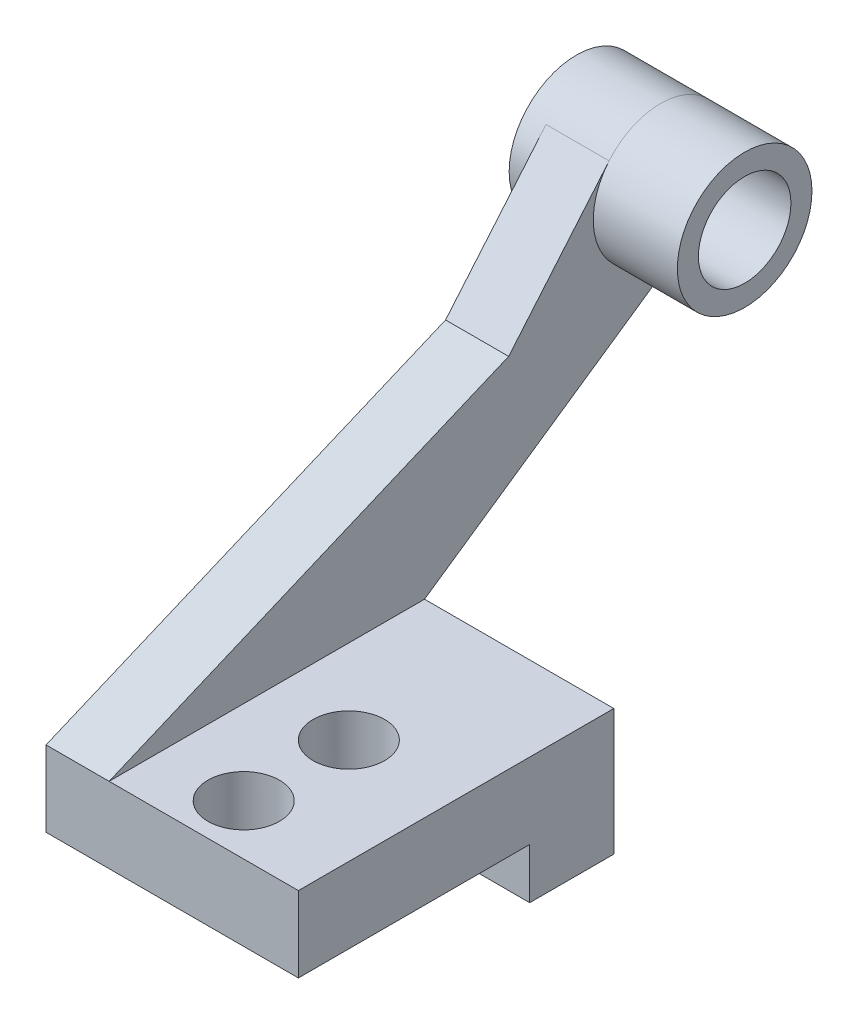
ISO-10303-21;
HEADER;
FILE_DESCRIPTION(('STEP AP214'),'2;1');
FILE_NAME('part.step','',(''),(''),'','','');
FILE_SCHEMA(('AUTOMOTIVE_DESIGN { 1 0 10303 214 1 1 1 1 }'));
ENDSEC;
DATA;
#1=APPLICATION_CONTEXT('core data for automotive mechanical design processes');
#2=APPLICATION_PROTOCOL_DEFINITION('international standard','automotive_design',2000,#1);
#3=PRODUCT_CONTEXT('',#1,'mechanical');
#4=PRODUCT('Part','Part','',(#3));
#5=PRODUCT_RELATED_PRODUCT_CATEGORY('part','',(#4));
#6=PRODUCT_DEFINITION_FORMATION('','',#4);
#7=PRODUCT_DEFINITION_CONTEXT('part definition',#1,'design');
#8=PRODUCT_DEFINITION('design','',#6,#7);
#9=PRODUCT_DEFINITION_SHAPE('','',#8);
#10=(LENGTH_UNIT() NAMED_UNIT(*) SI_UNIT(.MILLI.,.METRE.));
#11=(NAMED_UNIT(*) PLANE_ANGLE_UNIT() SI_UNIT($,.RADIAN.));
#12=(NAMED_UNIT(*) SI_UNIT($,.STERADIAN.) SOLID_ANGLE_UNIT());
#13=UNCERTAINTY_MEASURE_WITH_UNIT(LENGTH_MEASURE(1.E-05),#10,'distance_accuracy_value','');
#14=(GEOMETRIC_REPRESENTATION_CONTEXT(3) GLOBAL_UNCERTAINTY_ASSIGNED_CONTEXT((#13)) GLOBAL_UNIT_ASSIGNED_CONTEXT((#10,
#11,#12)) REPRESENTATION_CONTEXT('',''));
#15=CARTESIAN_POINT('',(0.,0.,0.));
#16=DIRECTION('',(0.,0.,1.));
#17=DIRECTION('',(1.,0.,0.));
#18=AXIS2_PLACEMENT_3D('',#15,#16,#17);
#19=CARTESIAN_POINT('',(-60.,0.,-25.6553758959827));
#20=DIRECTION('',(0.,-1.,0.));
#21=DIRECTION('',(0.,0.,-1.));
#22=AXIS2_PLACEMENT_3D('',#19,#20,#21);
#23=PLANE('',#22);
#24=CARTESIAN_POINT('',(-25.,0.,17.3446241040173));
#25=DIRECTION('',(0.,-1.,0.));
#26=DIRECTION('',(0.,0.,-1.));
#27=AXIS2_PLACEMENT_3D('',#24,#25,#26);
#28=CIRCLE('',#27,8.5);
#29=CARTESIAN_POINT('',(-25.,0.,8.84462410401734));
#30=VERTEX_POINT('',#29);
#31=EDGE_CURVE('E252',#30,#30,#28,.T.);
#32=ORIENTED_EDGE('',*,*,#31,.F.);
#33=EDGE_LOOP('',(#32));
#34=FACE_BOUND('',#33,.T.);
#35=CARTESIAN_POINT('',(-25.,0.,-7.65537589598266));
#36=DIRECTION('',(0.,-1.,0.));
#37=DIRECTION('',(0.,0.,-1.));
#38=AXIS2_PLACEMENT_3D('',#35,#36,#37);
#39=CIRCLE('',#38,8.5);
#40=CARTESIAN_POINT('',(-25.,0.,-16.1553758959827));
#41=VERTEX_POINT('',#40);
#42=EDGE_CURVE('E255',#41,#41,#39,.T.);
#43=ORIENTED_EDGE('',*,*,#42,.F.);
#44=EDGE_LOOP('',(#43));
#45=FACE_BOUND('',#44,.T.);
#46=DIRECTION('',(0.,0.,-1.));
#47=VECTOR('',#46,1.);
#48=CARTESIAN_POINT('',(0.,0.,-25.6553758959827));
#49=LINE('',#48,#47);
#50=CARTESIAN_POINT('',(0.,0.,29.3446241040173));
#51=VERTEX_POINT('',#50);
#52=CARTESIAN_POINT('',(0.,0.,-25.6553758959827));
#53=VERTEX_POINT('',#52);
#54=EDGE_CURVE('E177',#51,#53,#49,.T.);
#55=ORIENTED_EDGE('',*,*,#54,.F.);
#56=DIRECTION('',(1.,0.,0.));
#57=VECTOR('',#56,1.);
#58=CARTESIAN_POINT('',(-60.,0.,29.3446241040173));
#59=LINE('',#58,#57);
#60=CARTESIAN_POINT('',(-60.,0.,29.3446241040173));
#61=VERTEX_POINT('',#60);
#62=EDGE_CURVE('E67',#61,#51,#59,.T.);
#63=ORIENTED_EDGE('',*,*,#62,.F.);
#64=DIRECTION('',(0.,0.,-1.));
#65=VECTOR('',#64,1.);
#66=CARTESIAN_POINT('',(-60.,0.,-25.6553758959827));
#67=LINE('',#66,#65);
#68=CARTESIAN_POINT('',(-60.,0.,-25.6553758959827));
#69=VERTEX_POINT('',#68);
#70=EDGE_CURVE('E183',#61,#69,#67,.T.);
#71=ORIENTED_EDGE('',*,*,#70,.T.);
#72=DIRECTION('',(1.,0.,0.));
#73=VECTOR('',#72,1.);
#74=CARTESIAN_POINT('',(-60.,0.,-25.6553758959827));
#75=LINE('',#74,#73);
#76=EDGE_CURVE('E62',#69,#53,#75,.T.);
#77=ORIENTED_EDGE('',*,*,#76,.T.);
#78=EDGE_LOOP('',(#55,#63,#71,#77));
#79=FACE_BOUND('',#78,.T.);
#80=ADVANCED_FACE('F59',(#34,#45,#79),#23,.T.);
#81=CARTESIAN_POINT('',(-60.,0.,29.3446241040173));
#82=DIRECTION('',(0.,0.,1.));
#83=DIRECTION('',(0.,-1.,0.));
#84=AXIS2_PLACEMENT_3D('',#81,#82,#83);
#85=PLANE('',#84);
#86=DIRECTION('',(0.,-1.,0.));
#87=VECTOR('',#86,1.);
#88=CARTESIAN_POINT('',(0.,0.,29.3446241040173));
#89=LINE('',#88,#87);
#90=CARTESIAN_POINT('',(0.,18.,29.3446241040173));
#91=VERTEX_POINT('',#90);
#92=EDGE_CURVE('E186',#91,#51,#89,.T.);
#93=ORIENTED_EDGE('',*,*,#92,.F.);
#94=DIRECTION('',(1.,0.,0.));
#95=VECTOR('',#94,1.);
#96=CARTESIAN_POINT('',(-60.,18.,29.3446241040173));
#97=LINE('',#96,#95);
#98=CARTESIAN_POINT('',(-45.,18.,29.3446241040173));
#99=VERTEX_POINT('',#98);
#100=EDGE_CURVE('E152',#99,#91,#97,.T.);
#101=ORIENTED_EDGE('',*,*,#100,.F.);
#102=CARTESIAN_POINT('',(-60.,18.,29.3446241040173));
#103=VERTEX_POINT('',#102);
#104=EDGE_CURVE('E207',#103,#99,#97,.T.);
#105=ORIENTED_EDGE('',*,*,#104,.F.);
#106=DIRECTION('',(0.,-1.,0.));
#107=VECTOR('',#106,1.);
#108=CARTESIAN_POINT('',(-60.,0.,29.3446241040173));
#109=LINE('',#108,#107);
#110=EDGE_CURVE('E139',#103,#61,#109,.T.);
#111=ORIENTED_EDGE('',*,*,#110,.T.);
#112=ORIENTED_EDGE('',*,*,#62,.T.);
#113=EDGE_LOOP('',(#93,#101,#105,#111,#112));
#114=FACE_BOUND('',#113,.T.);
#115=ADVANCED_FACE('F216',(#114),#85,.T.);
#116=CARTESIAN_POINT('',(-60.,18.,29.3446241040173));
#117=DIRECTION('',(0.,1.,0.));
#118=DIRECTION('',(0.,0.,1.));
#119=AXIS2_PLACEMENT_3D('',#116,#117,#118);
#120=PLANE('',#119);
#121=CARTESIAN_POINT('',(-25.,18.,17.3446241040173));
#122=DIRECTION('',(0.,1.,0.));
#123=DIRECTION('',(0.,0.,1.));
#124=AXIS2_PLACEMENT_3D('',#121,#122,#123);
#125=CIRCLE('',#124,8.5);
#126=CARTESIAN_POINT('',(-25.,18.,25.8446241040173));
#127=VERTEX_POINT('',#126);
#128=EDGE_CURVE('E258',#127,#127,#125,.T.);
#129=ORIENTED_EDGE('',*,*,#128,.F.);
#130=EDGE_LOOP('',(#129));
#131=FACE_BOUND('',#130,.T.);
#132=CARTESIAN_POINT('',(-25.,18.,-7.65537589598266));
#133=DIRECTION('',(0.,1.,0.));
#134=DIRECTION('',(0.,0.,1.));
#135=AXIS2_PLACEMENT_3D('',#132,#133,#134);
#136=CIRCLE('',#135,8.5);
#137=CARTESIAN_POINT('',(-25.,18.,0.844624104017344));
#138=VERTEX_POINT('',#137);
#139=EDGE_CURVE('E259',#138,#138,#136,.T.);
#140=ORIENTED_EDGE('',*,*,#139,.F.);
#141=EDGE_LOOP('',(#140));
#142=FACE_BOUND('',#141,.T.);
#143=DIRECTION('',(0.,0.,-1.));
#144=VECTOR('',#143,1.);
#145=CARTESIAN_POINT('',(-45.,18.,0.));
#146=LINE('',#145,#144);
#147=CARTESIAN_POINT('',(-45.,18.,-45.6553758959827));
#148=VERTEX_POINT('',#147);
#149=EDGE_CURVE('E75',#99,#148,#146,.T.);
#150=ORIENTED_EDGE('',*,*,#149,.F.);
#151=ORIENTED_EDGE('',*,*,#100,.T.);
#152=DIRECTION('',(0.,0.,1.));
#153=VECTOR('',#152,1.);
#154=CARTESIAN_POINT('',(0.,18.,29.3446241040173));
#155=LINE('',#154,#153);
#156=CARTESIAN_POINT('',(0.,18.,-45.6553758959827));
#157=VERTEX_POINT('',#156);
#158=EDGE_CURVE('E201',#157,#91,#155,.T.);
#159=ORIENTED_EDGE('',*,*,#158,.F.);
#160=DIRECTION('',(1.,0.,0.));
#161=VECTOR('',#160,1.);
#162=CARTESIAN_POINT('',(-60.,18.,-45.6553758959827));
#163=LINE('',#162,#161);
#164=EDGE_CURVE('E153',#148,#157,#163,.T.);
#165=ORIENTED_EDGE('',*,*,#164,.F.);
#166=EDGE_LOOP('',(#150,#151,#159,#165));
#167=FACE_BOUND('',#166,.T.);
#168=ADVANCED_FACE('F267',(#131,#142,#167),#120,.T.);
#169=CARTESIAN_POINT('',(-60.,18.,-45.6553758959827));
#170=DIRECTION('',(0.,0.,-1.));
#171=DIRECTION('',(0.,1.,0.));
#172=AXIS2_PLACEMENT_3D('',#169,#170,#171);
#173=PLANE('',#172);
#174=DIRECTION('',(0.,1.,0.));
#175=VECTOR('',#174,1.);
#176=CARTESIAN_POINT('',(0.,18.,-45.6553758959827));
#177=LINE('',#176,#175);
#178=CARTESIAN_POINT('',(0.,-12.,-45.6553758959827));
#179=VERTEX_POINT('',#178);
#180=EDGE_CURVE('E198',#179,#157,#177,.T.);
#181=ORIENTED_EDGE('',*,*,#180,.F.);
#182=DIRECTION('',(1.,0.,0.));
#183=VECTOR('',#182,1.);
#184=CARTESIAN_POINT('',(-60.,-12.,-45.6553758959827));
#185=LINE('',#184,#183);
#186=CARTESIAN_POINT('',(-60.,-12.,-45.6553758959827));
#187=VERTEX_POINT('',#186);
#188=EDGE_CURVE('E134',#187,#179,#185,.T.);
#189=ORIENTED_EDGE('',*,*,#188,.F.);
#190=DIRECTION('',(0.,1.,0.));
#191=VECTOR('',#190,1.);
#192=CARTESIAN_POINT('',(-60.,18.,-45.6553758959827));
#193=LINE('',#192,#191);
#194=CARTESIAN_POINT('',(-60.,18.,-45.6553758959827));
#195=VERTEX_POINT('',#194);
#196=EDGE_CURVE('E128',#187,#195,#193,.T.);
#197=ORIENTED_EDGE('',*,*,#196,.T.);
#198=EDGE_CURVE('E133',#195,#148,#163,.T.);
#199=ORIENTED_EDGE('',*,*,#198,.T.);
#200=ORIENTED_EDGE('',*,*,#164,.T.);
#201=EDGE_LOOP('',(#181,#189,#197,#199,#200));
#202=FACE_BOUND('',#201,.T.);
#203=ADVANCED_FACE('F131',(#202),#173,.T.);
#204=CARTESIAN_POINT('',(-60.,-12.,-45.6553758959827));
#205=DIRECTION('',(0.,-1.,0.));
#206=DIRECTION('',(0.,0.,-1.));
#207=AXIS2_PLACEMENT_3D('',#204,#205,#206);
#208=PLANE('',#207);
#209=DIRECTION('',(0.,0.,-1.));
#210=VECTOR('',#209,1.);
#211=CARTESIAN_POINT('',(0.,-12.,-45.6553758959827));
#212=LINE('',#211,#210);
#213=CARTESIAN_POINT('',(0.,-12.,-25.6553758959827));
#214=VERTEX_POINT('',#213);
#215=EDGE_CURVE('E195',#214,#179,#212,.T.);
#216=ORIENTED_EDGE('',*,*,#215,.F.);
#217=DIRECTION('',(1.,0.,0.));
#218=VECTOR('',#217,1.);
#219=CARTESIAN_POINT('',(-60.,-12.,-25.6553758959827));
#220=LINE('',#219,#218);
#221=CARTESIAN_POINT('',(-60.,-12.,-25.6553758959827));
#222=VERTEX_POINT('',#221);
#223=EDGE_CURVE('E210',#222,#214,#220,.T.);
#224=ORIENTED_EDGE('',*,*,#223,.F.);
#225=DIRECTION('',(0.,0.,-1.));
#226=VECTOR('',#225,1.);
#227=CARTESIAN_POINT('',(-60.,-12.,-45.6553758959827));
#228=LINE('',#227,#226);
#229=EDGE_CURVE('E140',#222,#187,#228,.T.);
#230=ORIENTED_EDGE('',*,*,#229,.T.);
#231=ORIENTED_EDGE('',*,*,#188,.T.);
#232=EDGE_LOOP('',(#216,#224,#230,#231));
#233=FACE_BOUND('',#232,.T.);
#234=ADVANCED_FACE('F303',(#233),#208,.T.);
#235=CARTESIAN_POINT('',(-60.,-12.,-25.6553758959827));
#236=DIRECTION('',(0.,0.,1.));
#237=DIRECTION('',(1.,0.,0.));
#238=AXIS2_PLACEMENT_3D('',#235,#236,#237);
#239=PLANE('',#238);
#240=DIRECTION('',(0.,-1.,0.));
#241=VECTOR('',#240,1.);
#242=CARTESIAN_POINT('',(0.,-12.,-25.6553758959827));
#243=LINE('',#242,#241);
#244=EDGE_CURVE('E192',#53,#214,#243,.T.);
#245=ORIENTED_EDGE('',*,*,#244,.F.);
#246=ORIENTED_EDGE('',*,*,#76,.F.);
#247=DIRECTION('',(0.,-1.,0.));
#248=VECTOR('',#247,1.);
#249=CARTESIAN_POINT('',(-60.,-12.,-25.6553758959827));
#250=LINE('',#249,#248);
#251=EDGE_CURVE('E185',#69,#222,#250,.T.);
#252=ORIENTED_EDGE('',*,*,#251,.T.);
#253=ORIENTED_EDGE('',*,*,#223,.T.);
#254=EDGE_LOOP('',(#245,#246,#252,#253));
#255=FACE_BOUND('',#254,.T.);
#256=ADVANCED_FACE('F212',(#255),#239,.T.);
#257=CARTESIAN_POINT('',(-60.,0.,0.));
#258=DIRECTION('',(-1.,0.,0.));
#259=DIRECTION('',(0.,0.,1.));
#260=AXIS2_PLACEMENT_3D('',#257,#258,#259);
#261=PLANE('',#260);
#262=CARTESIAN_POINT('',(-60.,76.,-101.767701538135));
#263=DIRECTION('',(-1.,0.,0.));
#264=DIRECTION('',(0.,0.,1.));
#265=AXIS2_PLACEMENT_3D('',#262,#263,#264);
#266=CIRCLE('',#265,16.);
#267=CARTESIAN_POINT('',(-60.,62.8159230644065,-110.833026427865));
#268=VERTEX_POINT('',#267);
#269=CARTESIAN_POINT('',(-60.,86.3155137596286,-89.5369952676489));
#270=VERTEX_POINT('',#269);
#271=EDGE_CURVE('E12',#268,#270,#266,.T.);
#272=ORIENTED_EDGE('',*,*,#271,.F.);
#273=DIRECTION('',(0.,0.566582805608105,-0.824004808474592));
#274=VECTOR('',#273,1.);
#275=CARTESIAN_POINT('',(-60.,-9.09327574063561,-6.25250438870018));
#276=LINE('',#275,#274);
#277=EDGE_CURVE('E148',#195,#268,#276,.T.);
#278=ORIENTED_EDGE('',*,*,#277,.F.);
#279=ORIENTED_EDGE('',*,*,#196,.F.);
#280=ORIENTED_EDGE('',*,*,#229,.F.);
#281=ORIENTED_EDGE('',*,*,#251,.F.);
#282=ORIENTED_EDGE('',*,*,#70,.F.);
#283=ORIENTED_EDGE('',*,*,#110,.F.);
#284=DIRECTION('',(0.,0.388057000058133,-0.921635375138065));
#285=VECTOR('',#284,1.);
#286=CARTESIAN_POINT('',(-60.,25.7844302677897,10.8566022180167));
#287=LINE('',#286,#285);
#288=CARTESIAN_POINT('',(-60.,58.,-65.6553758959827));
#289=VERTEX_POINT('',#288);
#290=EDGE_CURVE('E159',#103,#289,#287,.T.);
#291=ORIENTED_EDGE('',*,*,#290,.T.);
#292=DIRECTION('',(0.,-0.764419141905391,0.644719609976791));
#293=VECTOR('',#292,1.);
#294=CARTESIAN_POINT('',(-60.,-8.24885778078215,-9.78035209245783));
#295=LINE('',#294,#293);
#296=EDGE_CURVE('E163',#270,#289,#295,.T.);
#297=ORIENTED_EDGE('',*,*,#296,.F.);
#298=EDGE_LOOP('',(#272,#278,#279,#280,#281,#282,#283,#291,#297));
#299=FACE_BOUND('',#298,.T.);
#300=ADVANCED_FACE('F156',(#299),#261,.T.);
#301=CARTESIAN_POINT('',(0.,0.,0.));
#302=DIRECTION('',(-1.,0.,0.));
#303=DIRECTION('',(0.,0.,1.));
#304=AXIS2_PLACEMENT_3D('',#301,#302,#303);
#305=PLANE('',#304);
#306=ORIENTED_EDGE('',*,*,#54,.T.);
#307=ORIENTED_EDGE('',*,*,#244,.T.);
#308=ORIENTED_EDGE('',*,*,#215,.T.);
#309=ORIENTED_EDGE('',*,*,#180,.T.);
#310=ORIENTED_EDGE('',*,*,#158,.T.);
#311=ORIENTED_EDGE('',*,*,#92,.T.);
#312=EDGE_LOOP('',(#306,#307,#308,#309,#310,#311));
#313=FACE_BOUND('',#312,.T.);
#314=ADVANCED_FACE('F214',(#313),#305,.F.);
#315=CARTESIAN_POINT('',(-45.,-8.24885778078215,-9.78035209245783));
#316=DIRECTION('',(0.,-0.644719609976791,-0.764419141905391));
#317=DIRECTION('',(0.,0.764419141905391,-0.644719609976791));
#318=AXIS2_PLACEMENT_3D('',#315,#316,#317);
#319=PLANE('',#318);
#320=ORIENTED_EDGE('',*,*,#296,.T.);
#321=DIRECTION('',(-1.,0.,0.));
#322=VECTOR('',#321,1.);
#323=CARTESIAN_POINT('',(-45.,58.,-65.6553758959827));
#324=LINE('',#323,#322);
#325=CARTESIAN_POINT('',(-45.,58.,-65.6553758959827));
#326=VERTEX_POINT('',#325);
#327=EDGE_CURVE('E178',#326,#289,#324,.T.);
#328=ORIENTED_EDGE('',*,*,#327,.F.);
#329=DIRECTION('',(0.,-0.764419141905391,0.644719609976791));
#330=VECTOR('',#329,1.);
#331=CARTESIAN_POINT('',(-45.,-8.24885778078215,-9.78035209245783));
#332=LINE('',#331,#330);
#333=CARTESIAN_POINT('',(-45.,86.1057396841625,-89.360069478244));
#334=VERTEX_POINT('',#333);
#335=EDGE_CURVE('E229',#334,#326,#332,.T.);
#336=ORIENTED_EDGE('',*,*,#335,.F.);
#337=CARTESIAN_POINT('',(-45.,86.3155137596286,-89.5369952676489));
#338=VERTEX_POINT('',#337);
#339=EDGE_CURVE('E169',#338,#334,#332,.T.);
#340=ORIENTED_EDGE('',*,*,#339,.F.);
#341=DIRECTION('',(-1.,0.,0.));
#342=VECTOR('',#341,1.);
#343=CARTESIAN_POINT('',(-45.,86.3155137596286,-89.5369952676489));
#344=LINE('',#343,#342);
#345=EDGE_CURVE('E174',#338,#270,#344,.T.);
#346=ORIENTED_EDGE('',*,*,#345,.T.);
#347=EDGE_LOOP('',(#320,#328,#336,#340,#346));
#348=FACE_BOUND('',#347,.T.);
#349=ADVANCED_FACE('F313',(#348),#319,.F.);
#350=CARTESIAN_POINT('',(-45.,25.7844302677897,10.8566022180167));
#351=DIRECTION('',(0.,0.921635375138065,0.388057000058133));
#352=DIRECTION('',(0.,-0.388057000058133,0.921635375138065));
#353=AXIS2_PLACEMENT_3D('',#350,#351,#352);
#354=PLANE('',#353);
#355=ORIENTED_EDGE('',*,*,#290,.F.);
#356=ORIENTED_EDGE('',*,*,#104,.T.);
#357=DIRECTION('',(0.,0.388057000058133,-0.921635375138065));
#358=VECTOR('',#357,1.);
#359=CARTESIAN_POINT('',(-45.,25.7844302677897,10.8566022180167));
#360=LINE('',#359,#358);
#361=EDGE_CURVE('E223',#99,#326,#360,.T.);
#362=ORIENTED_EDGE('',*,*,#361,.T.);
#363=ORIENTED_EDGE('',*,*,#327,.T.);
#364=EDGE_LOOP('',(#355,#356,#362,#363));
#365=FACE_BOUND('',#364,.T.);
#366=ADVANCED_FACE('F222',(#365),#354,.T.);
#367=CARTESIAN_POINT('',(-45.,-9.09327574063561,-6.25250438870018));
#368=DIRECTION('',(0.,0.824004808474592,0.566582805608105));
#369=DIRECTION('',(0.,-0.566582805608105,0.824004808474592));
#370=AXIS2_PLACEMENT_3D('',#367,#368,#369);
#371=PLANE('',#370);
#372=ORIENTED_EDGE('',*,*,#277,.T.);
#373=DIRECTION('',(-1.,0.,0.));
#374=VECTOR('',#373,1.);
#375=CARTESIAN_POINT('',(-45.,62.8159230644065,-110.833026427865));
#376=LINE('',#375,#374);
#377=CARTESIAN_POINT('',(-45.,62.8159230644065,-110.833026427865));
#378=VERTEX_POINT('',#377);
#379=EDGE_CURVE('E181',#378,#268,#376,.T.);
#380=ORIENTED_EDGE('',*,*,#379,.F.);
#381=DIRECTION('',(0.,0.566582805608105,-0.824004808474592));
#382=VECTOR('',#381,1.);
#383=CARTESIAN_POINT('',(-45.,-9.09327574063561,-6.25250438870018));
#384=LINE('',#383,#382);
#385=CARTESIAN_POINT('',(-45.,62.6604397991311,-110.606900684273));
#386=VERTEX_POINT('',#385);
#387=EDGE_CURVE('E166',#386,#378,#384,.T.);
#388=ORIENTED_EDGE('',*,*,#387,.F.);
#389=DIRECTION('',(0.,0.566582805608105,-0.824004808474592));
#390=VECTOR('',#389,1.);
#391=CARTESIAN_POINT('',(-45.,-9.09327574063561,-6.25250438870018));
#392=LINE('',#391,#390);
#393=EDGE_CURVE('E151',#148,#386,#392,.T.);
#394=ORIENTED_EDGE('',*,*,#393,.F.);
#395=ORIENTED_EDGE('',*,*,#198,.F.);
#396=EDGE_LOOP('',(#372,#380,#388,#394,#395));
#397=FACE_BOUND('',#396,.T.);
#398=ADVANCED_FACE('F145',(#397),#371,.F.);
#399=CARTESIAN_POINT('',(-45.,0.,0.));
#400=DIRECTION('',(-1.,0.,0.));
#401=DIRECTION('',(0.,0.,1.));
#402=AXIS2_PLACEMENT_3D('',#399,#400,#401);
#403=PLANE('',#402);
#404=CARTESIAN_POINT('',(-45.,76.,-101.767701538135));
#405=DIRECTION('',(1.,0.,0.));
#406=DIRECTION('',(0.,0.,-1.));
#407=AXIS2_PLACEMENT_3D('',#404,#405,#406);
#408=CIRCLE('',#407,16.0023531987547);
#409=EDGE_CURVE('E237',#334,#386,#408,.T.);
#410=ORIENTED_EDGE('',*,*,#409,.F.);
#411=ORIENTED_EDGE('',*,*,#335,.T.);
#412=ORIENTED_EDGE('',*,*,#361,.F.);
#413=ORIENTED_EDGE('',*,*,#149,.T.);
#414=ORIENTED_EDGE('',*,*,#393,.T.);
#415=EDGE_LOOP('',(#410,#411,#412,#413,#414));
#416=FACE_BOUND('',#415,.T.);
#417=ADVANCED_FACE('F227',(#416),#403,.F.);
#418=CARTESIAN_POINT('',(-45.,76.,-101.767701538135));
#419=DIRECTION('',(-1.,0.,0.));
#420=DIRECTION('',(0.,0.,1.));
#421=AXIS2_PLACEMENT_3D('',#418,#419,#420);
#422=CYLINDRICAL_SURFACE('',#421,16.);
#423=ORIENTED_EDGE('',*,*,#345,.F.);
#424=CARTESIAN_POINT('',(-45.,76.,-101.767701538135));
#425=DIRECTION('',(-1.,0.,0.));
#426=DIRECTION('',(0.,0.,1.));
#427=AXIS2_PLACEMENT_3D('',#424,#425,#426);
#428=CIRCLE('',#427,16.);
#429=EDGE_CURVE('E160',#338,#378,#428,.T.);
#430=ORIENTED_EDGE('',*,*,#429,.T.);
#431=ORIENTED_EDGE('',*,*,#379,.T.);
#432=ORIENTED_EDGE('',*,*,#271,.T.);
#433=EDGE_LOOP('',(#423,#430,#431,#432));
#434=FACE_BOUND('',#433,.T.);
#435=CARTESIAN_POINT('',(-65.,76.,-101.767701538135));
#436=DIRECTION('',(-1.,0.,0.));
#437=DIRECTION('',(0.,0.,1.));
#438=AXIS2_PLACEMENT_3D('',#435,#436,#437);
#439=CIRCLE('',#438,16.);
#440=CARTESIAN_POINT('',(-65.,76.,-85.7677015381351));
#441=VERTEX_POINT('',#440);
#442=EDGE_CURVE('E245',#441,#441,#439,.T.);
#443=ORIENTED_EDGE('',*,*,#442,.F.);
#444=EDGE_LOOP('',(#443));
#445=FACE_BOUND('',#444,.T.);
#446=ADVANCED_FACE('F314',(#434,#445),#422,.T.);
#447=CARTESIAN_POINT('',(-45.,76.,-101.767701538135));
#448=DIRECTION('',(1.,0.,0.));
#449=DIRECTION('',(0.,0.,-1.));
#450=AXIS2_PLACEMENT_3D('',#447,#448,#449);
#451=PLANE('',#450);
#452=ORIENTED_EDGE('',*,*,#429,.F.);
#453=ORIENTED_EDGE('',*,*,#339,.T.);
#454=EDGE_CURVE('E240',#386,#334,#408,.T.);
#455=ORIENTED_EDGE('',*,*,#454,.F.);
#456=ORIENTED_EDGE('',*,*,#387,.T.);
#457=EDGE_LOOP('',(#452,#453,#455,#456));
#458=FACE_BOUND('',#457,.T.);
#459=ADVANCED_FACE('F318',(#458),#451,.F.);
#460=CARTESIAN_POINT('',(-25.,76.,-101.767701538135));
#461=DIRECTION('',(1.,0.,0.));
#462=DIRECTION('',(0.,0.,-1.));
#463=AXIS2_PLACEMENT_3D('',#460,#461,#462);
#464=PLANE('',#463);
#465=CARTESIAN_POINT('',(-25.,76.,-101.767701538135));
#466=DIRECTION('',(1.,0.,0.));
#467=DIRECTION('',(0.,0.,-1.));
#468=AXIS2_PLACEMENT_3D('',#465,#466,#467);
#469=CIRCLE('',#468,16.0023531987547);
#470=CARTESIAN_POINT('',(-25.,76.,-117.77005473689));
#471=VERTEX_POINT('',#470);
#472=EDGE_CURVE('E236',#471,#471,#469,.T.);
#473=ORIENTED_EDGE('',*,*,#472,.T.);
#474=EDGE_LOOP('',(#473));
#475=FACE_BOUND('',#474,.T.);
#476=CARTESIAN_POINT('',(-25.,76.,-101.767701538135));
#477=DIRECTION('',(1.,0.,0.));
#478=DIRECTION('',(0.,0.,-1.));
#479=AXIS2_PLACEMENT_3D('',#476,#477,#478);
#480=CIRCLE('',#479,11.);
#481=CARTESIAN_POINT('',(-25.,76.,-112.767701538135));
#482=VERTEX_POINT('',#481);
#483=EDGE_CURVE('E243',#482,#482,#480,.T.);
#484=ORIENTED_EDGE('',*,*,#483,.F.);
#485=EDGE_LOOP('',(#484));
#486=FACE_BOUND('',#485,.T.);
#487=ADVANCED_FACE('F332',(#475,#486),#464,.T.);
#488=CARTESIAN_POINT('',(-25.,76.,-101.767701538135));
#489=DIRECTION('',(-1.,0.,0.));
#490=DIRECTION('',(0.,0.,1.));
#491=AXIS2_PLACEMENT_3D('',#488,#489,#490);
#492=CYLINDRICAL_SURFACE('',#491,16.0023531987547);
#493=ORIENTED_EDGE('',*,*,#472,.F.);
#494=EDGE_LOOP('',(#493));
#495=FACE_BOUND('',#494,.T.);
#496=ORIENTED_EDGE('',*,*,#409,.T.);
#497=ORIENTED_EDGE('',*,*,#454,.T.);
#498=EDGE_LOOP('',(#496,#497));
#499=FACE_BOUND('',#498,.T.);
#500=ADVANCED_FACE('F329',(#495,#499),#492,.T.);
#501=CARTESIAN_POINT('',(-25.,76.,-101.767701538135));
#502=DIRECTION('',(-1.,0.,0.));
#503=DIRECTION('',(0.,0.,1.));
#504=AXIS2_PLACEMENT_3D('',#501,#502,#503);
#505=CYLINDRICAL_SURFACE('',#504,11.);
#506=ORIENTED_EDGE('',*,*,#483,.T.);
#507=EDGE_LOOP('',(#506));
#508=FACE_BOUND('',#507,.T.);
#509=CARTESIAN_POINT('',(-65.,76.,-101.767701538135));
#510=DIRECTION('',(-1.,0.,0.));
#511=DIRECTION('',(0.,0.,1.));
#512=AXIS2_PLACEMENT_3D('',#509,#510,#511);
#513=CIRCLE('',#512,11.);
#514=CARTESIAN_POINT('',(-65.,76.,-90.7677015381351));
#515=VERTEX_POINT('',#514);
#516=EDGE_CURVE('E249',#515,#515,#513,.T.);
#517=ORIENTED_EDGE('',*,*,#516,.T.);
#518=EDGE_LOOP('',(#517));
#519=FACE_BOUND('',#518,.T.);
#520=ADVANCED_FACE('F284',(#508,#519),#505,.F.);
#521=CARTESIAN_POINT('',(-65.,76.,-101.767701538135));
#522=DIRECTION('',(-1.,0.,0.));
#523=DIRECTION('',(0.,0.,1.));
#524=AXIS2_PLACEMENT_3D('',#521,#522,#523);
#525=PLANE('',#524);
#526=ORIENTED_EDGE('',*,*,#442,.T.);
#527=EDGE_LOOP('',(#526));
#528=FACE_BOUND('',#527,.T.);
#529=ORIENTED_EDGE('',*,*,#516,.F.);
#530=EDGE_LOOP('',(#529));
#531=FACE_BOUND('',#530,.T.);
#532=ADVANCED_FACE('F275',(#528,#531),#525,.T.);
#533=CARTESIAN_POINT('',(-25.,-12.,-7.65537589598266));
#534=DIRECTION('',(0.,1.,0.));
#535=DIRECTION('',(0.,0.,1.));
#536=AXIS2_PLACEMENT_3D('',#533,#534,#535);
#537=CYLINDRICAL_SURFACE('',#536,8.5);
#538=ORIENTED_EDGE('',*,*,#42,.T.);
#539=EDGE_LOOP('',(#538));
#540=FACE_BOUND('',#539,.T.);
#541=ORIENTED_EDGE('',*,*,#139,.T.);
#542=EDGE_LOOP('',(#541));
#543=FACE_BOUND('',#542,.T.);
#544=ADVANCED_FACE('F273',(#540,#543),#537,.F.);
#545=CARTESIAN_POINT('',(-25.,-12.,17.3446241040173));
#546=DIRECTION('',(0.,1.,0.));
#547=DIRECTION('',(0.,0.,1.));
#548=AXIS2_PLACEMENT_3D('',#545,#546,#547);
#549=CYLINDRICAL_SURFACE('',#548,8.5);
#550=ORIENTED_EDGE('',*,*,#31,.T.);
#551=EDGE_LOOP('',(#550));
#552=FACE_BOUND('',#551,.T.);
#553=ORIENTED_EDGE('',*,*,#128,.T.);
#554=EDGE_LOOP('',(#553));
#555=FACE_BOUND('',#554,.T.);
#556=ADVANCED_FACE('F265',(#552,#555),#549,.F.);
#557=CLOSED_SHELL('',(#80,#115,#168,#203,#234,#256,#300,#314,#349,#366,#398,#417,#446,#459,#487,
#500,#520,#532,#544,#556));
#558=MANIFOLD_SOLID_BREP('B2',#557);
#559=ADVANCED_BREP_SHAPE_REPRESENTATION('',(#18,#558),#14);
#560=SHAPE_DEFINITION_REPRESENTATION(#9,#559);
ENDSEC;
END-ISO-10303-21;
